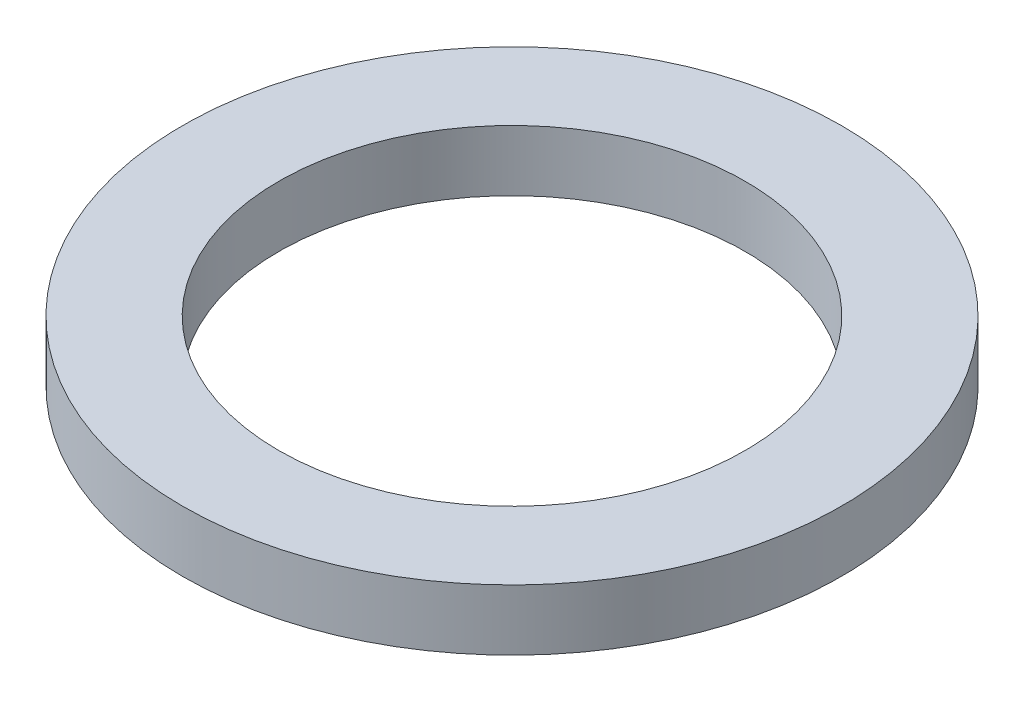
ISO-10303-21;
HEADER;
FILE_DESCRIPTION(('STEP AP214'),'2;1');
FILE_NAME('part.step','',(''),(''),'','','');
FILE_SCHEMA(('AUTOMOTIVE_DESIGN { 1 0 10303 214 1 1 1 1 }'));
ENDSEC;
DATA;
#1=APPLICATION_CONTEXT('core data for automotive mechanical design processes');
#2=APPLICATION_PROTOCOL_DEFINITION('international standard','automotive_design',2000,#1);
#3=PRODUCT_CONTEXT('',#1,'mechanical');
#4=PRODUCT('Part','Part','',(#3));
#5=PRODUCT_RELATED_PRODUCT_CATEGORY('part','',(#4));
#6=PRODUCT_DEFINITION_FORMATION('','',#4);
#7=PRODUCT_DEFINITION_CONTEXT('part definition',#1,'design');
#8=PRODUCT_DEFINITION('design','',#6,#7);
#9=PRODUCT_DEFINITION_SHAPE('','',#8);
#10=(LENGTH_UNIT() NAMED_UNIT(*) SI_UNIT(.MILLI.,.METRE.));
#11=(NAMED_UNIT(*) PLANE_ANGLE_UNIT() SI_UNIT($,.RADIAN.));
#12=(NAMED_UNIT(*) SI_UNIT($,.STERADIAN.) SOLID_ANGLE_UNIT());
#13=UNCERTAINTY_MEASURE_WITH_UNIT(LENGTH_MEASURE(1.E-05),#10,'distance_accuracy_value','');
#14=(GEOMETRIC_REPRESENTATION_CONTEXT(3) GLOBAL_UNCERTAINTY_ASSIGNED_CONTEXT((#13)) GLOBAL_UNIT_ASSIGNED_CONTEXT((#10,
#11,#12)) REPRESENTATION_CONTEXT('',''));
#15=CARTESIAN_POINT('',(0.,0.,0.));
#16=DIRECTION('',(0.,0.,1.));
#17=DIRECTION('',(1.,0.,0.));
#18=AXIS2_PLACEMENT_3D('',#15,#16,#17);
#19=CARTESIAN_POINT('',(0.,6.,0.));
#20=DIRECTION('',(0.,1.,0.));
#21=DIRECTION('',(0.,0.,1.));
#22=AXIS2_PLACEMENT_3D('',#19,#20,#21);
#23=PLANE('',#22);
#24=CARTESIAN_POINT('',(0.,6.,0.));
#25=DIRECTION('',(0.,1.,0.));
#26=DIRECTION('',(0.,0.,1.));
#27=AXIS2_PLACEMENT_3D('',#24,#25,#26);
#28=CIRCLE('',#27,32.5);
#29=CARTESIAN_POINT('',(0.,6.,32.5));
#30=VERTEX_POINT('',#29);
#31=EDGE_CURVE('E10',#30,#30,#28,.T.);
#32=ORIENTED_EDGE('',*,*,#31,.T.);
#33=EDGE_LOOP('',(#32));
#34=FACE_BOUND('',#33,.T.);
#35=CARTESIAN_POINT('',(0.,6.,0.));
#36=DIRECTION('',(0.,1.,0.));
#37=DIRECTION('',(0.,0.,1.));
#38=AXIS2_PLACEMENT_3D('',#35,#36,#37);
#39=CIRCLE('',#38,23.);
#40=CARTESIAN_POINT('',(0.,6.,23.));
#41=VERTEX_POINT('',#40);
#42=EDGE_CURVE('E43',#41,#41,#39,.T.);
#43=ORIENTED_EDGE('',*,*,#42,.F.);
#44=EDGE_LOOP('',(#43));
#45=FACE_BOUND('',#44,.T.);
#46=ADVANCED_FACE('F32',(#34,#45),#23,.T.);
#47=CARTESIAN_POINT('',(0.,0.,0.));
#48=DIRECTION('',(0.,1.,0.));
#49=DIRECTION('',(0.,0.,1.));
#50=AXIS2_PLACEMENT_3D('',#47,#48,#49);
#51=PLANE('',#50);
#52=CARTESIAN_POINT('',(0.,0.,0.));
#53=DIRECTION('',(0.,1.,0.));
#54=DIRECTION('',(0.,0.,1.));
#55=AXIS2_PLACEMENT_3D('',#52,#53,#54);
#56=CIRCLE('',#55,32.5);
#57=CARTESIAN_POINT('',(0.,0.,32.5));
#58=VERTEX_POINT('',#57);
#59=EDGE_CURVE('E36',#58,#58,#56,.T.);
#60=ORIENTED_EDGE('',*,*,#59,.F.);
#61=EDGE_LOOP('',(#60));
#62=FACE_BOUND('',#61,.T.);
#63=CARTESIAN_POINT('',(0.,0.,0.));
#64=DIRECTION('',(0.,1.,0.));
#65=DIRECTION('',(0.,0.,1.));
#66=AXIS2_PLACEMENT_3D('',#63,#64,#65);
#67=CIRCLE('',#66,23.);
#68=CARTESIAN_POINT('',(0.,0.,23.));
#69=VERTEX_POINT('',#68);
#70=EDGE_CURVE('E45',#69,#69,#67,.T.);
#71=ORIENTED_EDGE('',*,*,#70,.T.);
#72=EDGE_LOOP('',(#71));
#73=FACE_BOUND('',#72,.T.);
#74=ADVANCED_FACE('F55',(#62,#73),#51,.F.);
#75=CARTESIAN_POINT('',(0.,6.,0.));
#76=DIRECTION('',(0.,-1.,0.));
#77=DIRECTION('',(0.,0.,-1.));
#78=AXIS2_PLACEMENT_3D('',#75,#76,#77);
#79=CYLINDRICAL_SURFACE('',#78,32.5);
#80=ORIENTED_EDGE('',*,*,#31,.F.);
#81=EDGE_LOOP('',(#80));
#82=FACE_BOUND('',#81,.T.);
#83=ORIENTED_EDGE('',*,*,#59,.T.);
#84=EDGE_LOOP('',(#83));
#85=FACE_BOUND('',#84,.T.);
#86=ADVANCED_FACE('F34',(#82,#85),#79,.T.);
#87=CARTESIAN_POINT('',(0.,6.,0.));
#88=DIRECTION('',(0.,-1.,0.));
#89=DIRECTION('',(0.,0.,-1.));
#90=AXIS2_PLACEMENT_3D('',#87,#88,#89);
#91=CYLINDRICAL_SURFACE('',#90,23.);
#92=ORIENTED_EDGE('',*,*,#42,.T.);
#93=EDGE_LOOP('',(#92));
#94=FACE_BOUND('',#93,.T.);
#95=ORIENTED_EDGE('',*,*,#70,.F.);
#96=EDGE_LOOP('',(#95));
#97=FACE_BOUND('',#96,.T.);
#98=ADVANCED_FACE('F51',(#94,#97),#91,.F.);
#99=CLOSED_SHELL('',(#46,#74,#86,#98));
#100=MANIFOLD_SOLID_BREP('B2',#99);
#101=ADVANCED_BREP_SHAPE_REPRESENTATION('',(#18,#100),#14);
#102=SHAPE_DEFINITION_REPRESENTATION(#9,#101);
ENDSEC;
END-ISO-10303-21;
